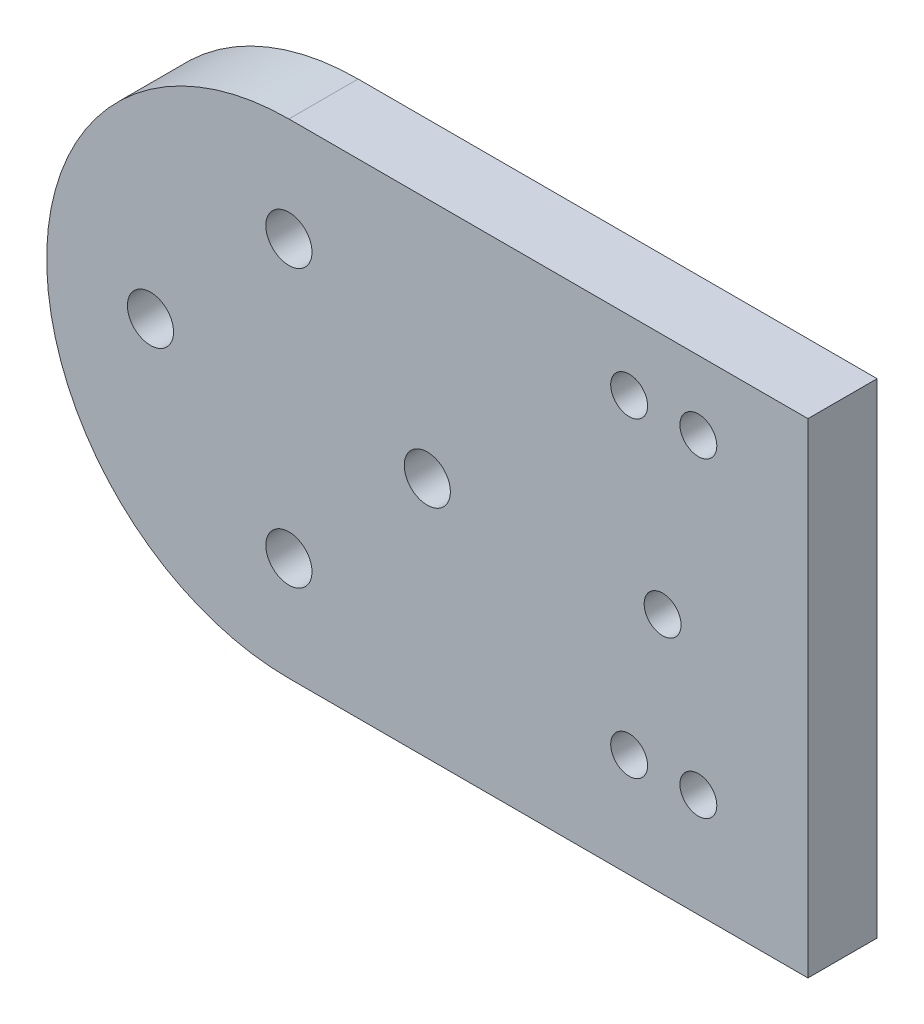
ISO-10303-21;
HEADER;
FILE_DESCRIPTION(('STEP AP214'),'2;1');
FILE_NAME('part.step','',(''),(''),'','','');
FILE_SCHEMA(('AUTOMOTIVE_DESIGN { 1 0 10303 214 1 1 1 1 }'));
ENDSEC;
DATA;
#1=APPLICATION_CONTEXT('core data for automotive mechanical design processes');
#2=APPLICATION_PROTOCOL_DEFINITION('international standard','automotive_design',2000,#1);
#3=PRODUCT_CONTEXT('',#1,'mechanical');
#4=PRODUCT('Part','Part','',(#3));
#5=PRODUCT_RELATED_PRODUCT_CATEGORY('part','',(#4));
#6=PRODUCT_DEFINITION_FORMATION('','',#4);
#7=PRODUCT_DEFINITION_CONTEXT('part definition',#1,'design');
#8=PRODUCT_DEFINITION('design','',#6,#7);
#9=PRODUCT_DEFINITION_SHAPE('','',#8);
#10=(LENGTH_UNIT() NAMED_UNIT(*) SI_UNIT(.MILLI.,.METRE.));
#11=(NAMED_UNIT(*) PLANE_ANGLE_UNIT() SI_UNIT($,.RADIAN.));
#12=(NAMED_UNIT(*) SI_UNIT($,.STERADIAN.) SOLID_ANGLE_UNIT());
#13=UNCERTAINTY_MEASURE_WITH_UNIT(LENGTH_MEASURE(1.E-05),#10,'distance_accuracy_value','');
#14=(GEOMETRIC_REPRESENTATION_CONTEXT(3) GLOBAL_UNCERTAINTY_ASSIGNED_CONTEXT((#13)) GLOBAL_UNIT_ASSIGNED_CONTEXT((#10,
#11,#12)) REPRESENTATION_CONTEXT('',''));
#15=CARTESIAN_POINT('',(0.,0.,0.));
#16=DIRECTION('',(0.,0.,1.));
#17=DIRECTION('',(1.,0.,0.));
#18=AXIS2_PLACEMENT_3D('',#15,#16,#17);
#19=CARTESIAN_POINT('',(0.,0.,6.));
#20=DIRECTION('',(0.,0.,-1.));
#21=DIRECTION('',(-1.,0.,0.));
#22=AXIS2_PLACEMENT_3D('',#19,#20,#21);
#23=CYLINDRICAL_SURFACE('',#22,21.);
#24=CARTESIAN_POINT('',(0.,0.,0.));
#25=DIRECTION('',(0.,0.,1.));
#26=DIRECTION('',(1.,0.,0.));
#27=AXIS2_PLACEMENT_3D('',#24,#25,#26);
#28=CIRCLE('',#27,21.);
#29=CARTESIAN_POINT('',(0.,21.,0.));
#30=VERTEX_POINT('',#29);
#31=CARTESIAN_POINT('',(0.,-21.,0.));
#32=VERTEX_POINT('',#31);
#33=EDGE_CURVE('E149',#30,#32,#28,.T.);
#34=ORIENTED_EDGE('',*,*,#33,.T.);
#35=DIRECTION('',(0.,0.,-1.));
#36=VECTOR('',#35,1.);
#37=CARTESIAN_POINT('',(0.,-21.,6.));
#38=LINE('',#37,#36);
#39=CARTESIAN_POINT('',(0.,-21.,6.));
#40=VERTEX_POINT('',#39);
#41=EDGE_CURVE('E11',#40,#32,#38,.T.);
#42=ORIENTED_EDGE('',*,*,#41,.F.);
#43=CARTESIAN_POINT('',(0.,0.,6.));
#44=DIRECTION('',(0.,0.,1.));
#45=DIRECTION('',(1.,0.,0.));
#46=AXIS2_PLACEMENT_3D('',#43,#44,#45);
#47=CIRCLE('',#46,21.);
#48=CARTESIAN_POINT('',(0.,21.,6.));
#49=VERTEX_POINT('',#48);
#50=EDGE_CURVE('E95',#49,#40,#47,.T.);
#51=ORIENTED_EDGE('',*,*,#50,.F.);
#52=DIRECTION('',(0.,0.,-1.));
#53=VECTOR('',#52,1.);
#54=CARTESIAN_POINT('',(0.,21.,6.));
#55=LINE('',#54,#53);
#56=EDGE_CURVE('E61',#49,#30,#55,.T.);
#57=ORIENTED_EDGE('',*,*,#56,.T.);
#58=EDGE_LOOP('',(#34,#42,#51,#57));
#59=FACE_BOUND('',#58,.T.);
#60=ADVANCED_FACE('F43',(#59),#23,.T.);
#61=CARTESIAN_POINT('',(0.,-21.,6.));
#62=DIRECTION('',(0.,1.,0.));
#63=DIRECTION('',(-1.,0.,0.));
#64=AXIS2_PLACEMENT_3D('',#61,#62,#63);
#65=PLANE('',#64);
#66=DIRECTION('',(1.,0.,0.));
#67=VECTOR('',#66,1.);
#68=CARTESIAN_POINT('',(0.,-21.,0.));
#69=LINE('',#68,#67);
#70=CARTESIAN_POINT('',(45.,-21.,0.));
#71=VERTEX_POINT('',#70);
#72=EDGE_CURVE('E101',#32,#71,#69,.T.);
#73=ORIENTED_EDGE('',*,*,#72,.T.);
#74=DIRECTION('',(0.,0.,-1.));
#75=VECTOR('',#74,1.);
#76=CARTESIAN_POINT('',(45.,-21.,6.));
#77=LINE('',#76,#75);
#78=CARTESIAN_POINT('',(45.,-21.,6.));
#79=VERTEX_POINT('',#78);
#80=EDGE_CURVE('E53',#79,#71,#77,.T.);
#81=ORIENTED_EDGE('',*,*,#80,.F.);
#82=DIRECTION('',(1.,0.,0.));
#83=VECTOR('',#82,1.);
#84=CARTESIAN_POINT('',(0.,-21.,6.));
#85=LINE('',#84,#83);
#86=EDGE_CURVE('E86',#40,#79,#85,.T.);
#87=ORIENTED_EDGE('',*,*,#86,.F.);
#88=ORIENTED_EDGE('',*,*,#41,.T.);
#89=EDGE_LOOP('',(#73,#81,#87,#88));
#90=FACE_BOUND('',#89,.T.);
#91=ADVANCED_FACE('F100',(#90),#65,.F.);
#92=CARTESIAN_POINT('',(45.,0.,6.));
#93=DIRECTION('',(1.,0.,0.));
#94=DIRECTION('',(0.,1.,0.));
#95=AXIS2_PLACEMENT_3D('',#92,#93,#94);
#96=PLANE('',#95);
#97=DIRECTION('',(0.,-1.,0.));
#98=VECTOR('',#97,1.);
#99=CARTESIAN_POINT('',(45.,0.,0.));
#100=LINE('',#99,#98);
#101=CARTESIAN_POINT('',(45.,21.,0.));
#102=VERTEX_POINT('',#101);
#103=EDGE_CURVE('E154',#102,#71,#100,.T.);
#104=ORIENTED_EDGE('',*,*,#103,.F.);
#105=DIRECTION('',(0.,0.,-1.));
#106=VECTOR('',#105,1.);
#107=CARTESIAN_POINT('',(45.,21.,6.));
#108=LINE('',#107,#106);
#109=CARTESIAN_POINT('',(45.,21.,6.));
#110=VERTEX_POINT('',#109);
#111=EDGE_CURVE('E75',#110,#102,#108,.T.);
#112=ORIENTED_EDGE('',*,*,#111,.F.);
#113=DIRECTION('',(0.,-1.,0.));
#114=VECTOR('',#113,1.);
#115=CARTESIAN_POINT('',(45.,0.,6.));
#116=LINE('',#115,#114);
#117=EDGE_CURVE('E94',#110,#79,#116,.T.);
#118=ORIENTED_EDGE('',*,*,#117,.T.);
#119=ORIENTED_EDGE('',*,*,#80,.T.);
#120=EDGE_LOOP('',(#104,#112,#118,#119));
#121=FACE_BOUND('',#120,.T.);
#122=ADVANCED_FACE('F105',(#121),#96,.T.);
#123=CARTESIAN_POINT('',(35.5,15.,6.));
#124=DIRECTION('',(0.,0.,-1.));
#125=DIRECTION('',(-1.,0.,0.));
#126=AXIS2_PLACEMENT_3D('',#123,#124,#125);
#127=CYLINDRICAL_SURFACE('',#126,1.6);
#128=CARTESIAN_POINT('',(35.5,15.,6.));
#129=DIRECTION('',(0.,0.,1.));
#130=DIRECTION('',(1.,0.,0.));
#131=AXIS2_PLACEMENT_3D('',#128,#129,#130);
#132=CIRCLE('',#131,1.6);
#133=CARTESIAN_POINT('',(37.1,15.,6.));
#134=VERTEX_POINT('',#133);
#135=EDGE_CURVE('E125',#134,#134,#132,.T.);
#136=ORIENTED_EDGE('',*,*,#135,.T.);
#137=EDGE_LOOP('',(#136));
#138=FACE_BOUND('',#137,.T.);
#139=CARTESIAN_POINT('',(35.5,15.,0.));
#140=DIRECTION('',(0.,0.,1.));
#141=DIRECTION('',(1.,0.,0.));
#142=AXIS2_PLACEMENT_3D('',#139,#140,#141);
#143=CIRCLE('',#142,1.6);
#144=CARTESIAN_POINT('',(37.1,15.,0.));
#145=VERTEX_POINT('',#144);
#146=EDGE_CURVE('E173',#145,#145,#143,.T.);
#147=ORIENTED_EDGE('',*,*,#146,.F.);
#148=EDGE_LOOP('',(#147));
#149=FACE_BOUND('',#148,.T.);
#150=ADVANCED_FACE('F262',(#138,#149),#127,.F.);
#151=CARTESIAN_POINT('',(35.5,-12.,6.));
#152=DIRECTION('',(0.,0.,-1.));
#153=DIRECTION('',(-1.,0.,0.));
#154=AXIS2_PLACEMENT_3D('',#151,#152,#153);
#155=CYLINDRICAL_SURFACE('',#154,1.6);
#156=CARTESIAN_POINT('',(35.5,-12.,6.));
#157=DIRECTION('',(0.,0.,1.));
#158=DIRECTION('',(1.,0.,0.));
#159=AXIS2_PLACEMENT_3D('',#156,#157,#158);
#160=CIRCLE('',#159,1.6);
#161=CARTESIAN_POINT('',(37.1,-12.,6.));
#162=VERTEX_POINT('',#161);
#163=EDGE_CURVE('E121',#162,#162,#160,.T.);
#164=ORIENTED_EDGE('',*,*,#163,.T.);
#165=EDGE_LOOP('',(#164));
#166=FACE_BOUND('',#165,.T.);
#167=CARTESIAN_POINT('',(35.5,-12.,0.));
#168=DIRECTION('',(0.,0.,1.));
#169=DIRECTION('',(1.,0.,0.));
#170=AXIS2_PLACEMENT_3D('',#167,#168,#169);
#171=CIRCLE('',#170,1.6);
#172=CARTESIAN_POINT('',(37.1,-12.,0.));
#173=VERTEX_POINT('',#172);
#174=EDGE_CURVE('E169',#173,#173,#171,.T.);
#175=ORIENTED_EDGE('',*,*,#174,.F.);
#176=EDGE_LOOP('',(#175));
#177=FACE_BOUND('',#176,.T.);
#178=ADVANCED_FACE('F264',(#166,#177),#155,.F.);
#179=CARTESIAN_POINT('',(29.5,-12.,6.));
#180=DIRECTION('',(0.,0.,-1.));
#181=DIRECTION('',(-1.,0.,0.));
#182=AXIS2_PLACEMENT_3D('',#179,#180,#181);
#183=CYLINDRICAL_SURFACE('',#182,1.6);
#184=CARTESIAN_POINT('',(29.5,-12.,6.));
#185=DIRECTION('',(0.,0.,1.));
#186=DIRECTION('',(1.,0.,0.));
#187=AXIS2_PLACEMENT_3D('',#184,#185,#186);
#188=CIRCLE('',#187,1.6);
#189=CARTESIAN_POINT('',(31.1,-12.,6.));
#190=VERTEX_POINT('',#189);
#191=EDGE_CURVE('E117',#190,#190,#188,.T.);
#192=ORIENTED_EDGE('',*,*,#191,.T.);
#193=EDGE_LOOP('',(#192));
#194=FACE_BOUND('',#193,.T.);
#195=CARTESIAN_POINT('',(29.5,-12.,0.));
#196=DIRECTION('',(0.,0.,1.));
#197=DIRECTION('',(1.,0.,0.));
#198=AXIS2_PLACEMENT_3D('',#195,#196,#197);
#199=CIRCLE('',#198,1.6);
#200=CARTESIAN_POINT('',(31.1,-12.,0.));
#201=VERTEX_POINT('',#200);
#202=EDGE_CURVE('E165',#201,#201,#199,.T.);
#203=ORIENTED_EDGE('',*,*,#202,.F.);
#204=EDGE_LOOP('',(#203));
#205=FACE_BOUND('',#204,.T.);
#206=ADVANCED_FACE('F271',(#194,#205),#183,.F.);
#207=CARTESIAN_POINT('',(32.4,0.,6.));
#208=DIRECTION('',(0.,0.,-1.));
#209=DIRECTION('',(-1.,0.,0.));
#210=AXIS2_PLACEMENT_3D('',#207,#208,#209);
#211=CYLINDRICAL_SURFACE('',#210,1.6);
#212=CARTESIAN_POINT('',(32.4,0.,6.));
#213=DIRECTION('',(0.,0.,1.));
#214=DIRECTION('',(1.,0.,0.));
#215=AXIS2_PLACEMENT_3D('',#212,#213,#214);
#216=CIRCLE('',#215,1.6);
#217=CARTESIAN_POINT('',(34.,0.,6.));
#218=VERTEX_POINT('',#217);
#219=EDGE_CURVE('E110',#218,#218,#216,.T.);
#220=ORIENTED_EDGE('',*,*,#219,.T.);
#221=EDGE_LOOP('',(#220));
#222=FACE_BOUND('',#221,.T.);
#223=CARTESIAN_POINT('',(32.4,0.,0.));
#224=DIRECTION('',(0.,0.,1.));
#225=DIRECTION('',(1.,0.,0.));
#226=AXIS2_PLACEMENT_3D('',#223,#224,#225);
#227=CIRCLE('',#226,1.6);
#228=CARTESIAN_POINT('',(34.,0.,0.));
#229=VERTEX_POINT('',#228);
#230=EDGE_CURVE('E161',#229,#229,#227,.T.);
#231=ORIENTED_EDGE('',*,*,#230,.F.);
#232=EDGE_LOOP('',(#231));
#233=FACE_BOUND('',#232,.T.);
#234=ADVANCED_FACE('F277',(#222,#233),#211,.F.);
#235=CARTESIAN_POINT('',(0.,21.,6.));
#236=DIRECTION('',(0.,1.,0.));
#237=DIRECTION('',(0.,0.,1.));
#238=AXIS2_PLACEMENT_3D('',#235,#236,#237);
#239=PLANE('',#238);
#240=DIRECTION('',(1.,0.,0.));
#241=VECTOR('',#240,1.);
#242=CARTESIAN_POINT('',(0.,21.,0.));
#243=LINE('',#242,#241);
#244=EDGE_CURVE('E157',#30,#102,#243,.T.);
#245=ORIENTED_EDGE('',*,*,#244,.F.);
#246=ORIENTED_EDGE('',*,*,#56,.F.);
#247=DIRECTION('',(1.,0.,0.));
#248=VECTOR('',#247,1.);
#249=CARTESIAN_POINT('',(0.,21.,6.));
#250=LINE('',#249,#248);
#251=EDGE_CURVE('E107',#49,#110,#250,.T.);
#252=ORIENTED_EDGE('',*,*,#251,.T.);
#253=ORIENTED_EDGE('',*,*,#111,.T.);
#254=EDGE_LOOP('',(#245,#246,#252,#253));
#255=FACE_BOUND('',#254,.T.);
#256=ADVANCED_FACE('F235',(#255),#239,.T.);
#257=CARTESIAN_POINT('',(0.,-12.,6.));
#258=DIRECTION('',(0.,0.,-1.));
#259=DIRECTION('',(-1.,0.,0.));
#260=AXIS2_PLACEMENT_3D('',#257,#258,#259);
#261=CYLINDRICAL_SURFACE('',#260,2.);
#262=CARTESIAN_POINT('',(0.,-12.,6.));
#263=DIRECTION('',(0.,0.,1.));
#264=DIRECTION('',(1.,0.,0.));
#265=AXIS2_PLACEMENT_3D('',#262,#263,#264);
#266=CIRCLE('',#265,2.);
#267=CARTESIAN_POINT('',(2.,-12.,6.));
#268=VERTEX_POINT('',#267);
#269=EDGE_CURVE('E201',#268,#268,#266,.T.);
#270=ORIENTED_EDGE('',*,*,#269,.T.);
#271=EDGE_LOOP('',(#270));
#272=FACE_BOUND('',#271,.T.);
#273=CARTESIAN_POINT('',(0.,-12.,0.));
#274=DIRECTION('',(0.,0.,1.));
#275=DIRECTION('',(1.,0.,0.));
#276=AXIS2_PLACEMENT_3D('',#273,#274,#275);
#277=CIRCLE('',#276,2.);
#278=CARTESIAN_POINT('',(2.,-12.,0.));
#279=VERTEX_POINT('',#278);
#280=EDGE_CURVE('E145',#279,#279,#277,.T.);
#281=ORIENTED_EDGE('',*,*,#280,.F.);
#282=EDGE_LOOP('',(#281));
#283=FACE_BOUND('',#282,.T.);
#284=ADVANCED_FACE('F207',(#272,#283),#261,.F.);
#285=CARTESIAN_POINT('',(-12.,0.,6.));
#286=DIRECTION('',(0.,0.,-1.));
#287=DIRECTION('',(-1.,0.,0.));
#288=AXIS2_PLACEMENT_3D('',#285,#286,#287);
#289=CYLINDRICAL_SURFACE('',#288,2.);
#290=CARTESIAN_POINT('',(-12.,0.,6.));
#291=DIRECTION('',(0.,0.,1.));
#292=DIRECTION('',(1.,0.,0.));
#293=AXIS2_PLACEMENT_3D('',#290,#291,#292);
#294=CIRCLE('',#293,2.);
#295=CARTESIAN_POINT('',(-10.,0.,6.));
#296=VERTEX_POINT('',#295);
#297=EDGE_CURVE('E195',#296,#296,#294,.T.);
#298=ORIENTED_EDGE('',*,*,#297,.T.);
#299=EDGE_LOOP('',(#298));
#300=FACE_BOUND('',#299,.T.);
#301=CARTESIAN_POINT('',(-12.,0.,0.));
#302=DIRECTION('',(0.,0.,1.));
#303=DIRECTION('',(1.,0.,0.));
#304=AXIS2_PLACEMENT_3D('',#301,#302,#303);
#305=CIRCLE('',#304,2.);
#306=CARTESIAN_POINT('',(-10.,0.,0.));
#307=VERTEX_POINT('',#306);
#308=EDGE_CURVE('E141',#307,#307,#305,.T.);
#309=ORIENTED_EDGE('',*,*,#308,.F.);
#310=EDGE_LOOP('',(#309));
#311=FACE_BOUND('',#310,.T.);
#312=ADVANCED_FACE('F234',(#300,#311),#289,.F.);
#313=CARTESIAN_POINT('',(0.,12.,6.));
#314=DIRECTION('',(0.,0.,-1.));
#315=DIRECTION('',(-1.,0.,0.));
#316=AXIS2_PLACEMENT_3D('',#313,#314,#315);
#317=CYLINDRICAL_SURFACE('',#316,2.);
#318=CARTESIAN_POINT('',(0.,12.,6.));
#319=DIRECTION('',(0.,0.,1.));
#320=DIRECTION('',(1.,0.,0.));
#321=AXIS2_PLACEMENT_3D('',#318,#319,#320);
#322=CIRCLE('',#321,2.);
#323=CARTESIAN_POINT('',(2.,12.,6.));
#324=VERTEX_POINT('',#323);
#325=EDGE_CURVE('E189',#324,#324,#322,.T.);
#326=ORIENTED_EDGE('',*,*,#325,.T.);
#327=EDGE_LOOP('',(#326));
#328=FACE_BOUND('',#327,.T.);
#329=CARTESIAN_POINT('',(0.,12.,0.));
#330=DIRECTION('',(0.,0.,1.));
#331=DIRECTION('',(1.,0.,0.));
#332=AXIS2_PLACEMENT_3D('',#329,#330,#331);
#333=CIRCLE('',#332,2.);
#334=CARTESIAN_POINT('',(2.,12.,0.));
#335=VERTEX_POINT('',#334);
#336=EDGE_CURVE('E137',#335,#335,#333,.T.);
#337=ORIENTED_EDGE('',*,*,#336,.F.);
#338=EDGE_LOOP('',(#337));
#339=FACE_BOUND('',#338,.T.);
#340=ADVANCED_FACE('F237',(#328,#339),#317,.F.);
#341=CARTESIAN_POINT('',(12.,0.,6.));
#342=DIRECTION('',(0.,0.,-1.));
#343=DIRECTION('',(-1.,0.,0.));
#344=AXIS2_PLACEMENT_3D('',#341,#342,#343);
#345=CYLINDRICAL_SURFACE('',#344,2.);
#346=CARTESIAN_POINT('',(12.,0.,6.));
#347=DIRECTION('',(0.,0.,1.));
#348=DIRECTION('',(1.,0.,0.));
#349=AXIS2_PLACEMENT_3D('',#346,#347,#348);
#350=CIRCLE('',#349,2.);
#351=CARTESIAN_POINT('',(14.,0.,6.));
#352=VERTEX_POINT('',#351);
#353=EDGE_CURVE('E181',#352,#352,#350,.T.);
#354=ORIENTED_EDGE('',*,*,#353,.T.);
#355=EDGE_LOOP('',(#354));
#356=FACE_BOUND('',#355,.T.);
#357=CARTESIAN_POINT('',(12.,0.,0.));
#358=DIRECTION('',(0.,0.,1.));
#359=DIRECTION('',(1.,0.,0.));
#360=AXIS2_PLACEMENT_3D('',#357,#358,#359);
#361=CIRCLE('',#360,2.);
#362=CARTESIAN_POINT('',(14.,0.,0.));
#363=VERTEX_POINT('',#362);
#364=EDGE_CURVE('E133',#363,#363,#361,.T.);
#365=ORIENTED_EDGE('',*,*,#364,.F.);
#366=EDGE_LOOP('',(#365));
#367=FACE_BOUND('',#366,.T.);
#368=ADVANCED_FACE('F45',(#356,#367),#345,.F.);
#369=CARTESIAN_POINT('',(29.5,15.,6.));
#370=DIRECTION('',(0.,0.,-1.));
#371=DIRECTION('',(-1.,0.,0.));
#372=AXIS2_PLACEMENT_3D('',#369,#370,#371);
#373=CYLINDRICAL_SURFACE('',#372,1.6);
#374=CARTESIAN_POINT('',(29.5,15.,6.));
#375=DIRECTION('',(0.,0.,1.));
#376=DIRECTION('',(1.,0.,0.));
#377=AXIS2_PLACEMENT_3D('',#374,#375,#376);
#378=CIRCLE('',#377,1.6);
#379=CARTESIAN_POINT('',(31.1,15.,6.));
#380=VERTEX_POINT('',#379);
#381=EDGE_CURVE('E129',#380,#380,#378,.T.);
#382=ORIENTED_EDGE('',*,*,#381,.T.);
#383=EDGE_LOOP('',(#382));
#384=FACE_BOUND('',#383,.T.);
#385=CARTESIAN_POINT('',(29.5,15.,0.));
#386=DIRECTION('',(0.,0.,1.));
#387=DIRECTION('',(1.,0.,0.));
#388=AXIS2_PLACEMENT_3D('',#385,#386,#387);
#389=CIRCLE('',#388,1.6);
#390=CARTESIAN_POINT('',(31.1,15.,0.));
#391=VERTEX_POINT('',#390);
#392=EDGE_CURVE('E177',#391,#391,#389,.T.);
#393=ORIENTED_EDGE('',*,*,#392,.F.);
#394=EDGE_LOOP('',(#393));
#395=FACE_BOUND('',#394,.T.);
#396=ADVANCED_FACE('F212',(#384,#395),#373,.F.);
#397=CARTESIAN_POINT('',(0.,0.,6.));
#398=DIRECTION('',(0.,0.,1.));
#399=DIRECTION('',(1.,0.,0.));
#400=AXIS2_PLACEMENT_3D('',#397,#398,#399);
#401=PLANE('',#400);
#402=ORIENTED_EDGE('',*,*,#353,.F.);
#403=EDGE_LOOP('',(#402));
#404=FACE_BOUND('',#403,.T.);
#405=ORIENTED_EDGE('',*,*,#325,.F.);
#406=EDGE_LOOP('',(#405));
#407=FACE_BOUND('',#406,.T.);
#408=ORIENTED_EDGE('',*,*,#297,.F.);
#409=EDGE_LOOP('',(#408));
#410=FACE_BOUND('',#409,.T.);
#411=ORIENTED_EDGE('',*,*,#269,.F.);
#412=EDGE_LOOP('',(#411));
#413=FACE_BOUND('',#412,.T.);
#414=ORIENTED_EDGE('',*,*,#50,.T.);
#415=ORIENTED_EDGE('',*,*,#86,.T.);
#416=ORIENTED_EDGE('',*,*,#117,.F.);
#417=ORIENTED_EDGE('',*,*,#251,.F.);
#418=EDGE_LOOP('',(#414,#415,#416,#417));
#419=FACE_BOUND('',#418,.T.);
#420=ORIENTED_EDGE('',*,*,#219,.F.);
#421=EDGE_LOOP('',(#420));
#422=FACE_BOUND('',#421,.T.);
#423=ORIENTED_EDGE('',*,*,#191,.F.);
#424=EDGE_LOOP('',(#423));
#425=FACE_BOUND('',#424,.T.);
#426=ORIENTED_EDGE('',*,*,#163,.F.);
#427=EDGE_LOOP('',(#426));
#428=FACE_BOUND('',#427,.T.);
#429=ORIENTED_EDGE('',*,*,#135,.F.);
#430=EDGE_LOOP('',(#429));
#431=FACE_BOUND('',#430,.T.);
#432=ORIENTED_EDGE('',*,*,#381,.F.);
#433=EDGE_LOOP('',(#432));
#434=FACE_BOUND('',#433,.T.);
#435=ADVANCED_FACE('F90',(#404,#407,#410,#413,#419,#422,#425,#428,#431,#434),#401,.T.);
#436=CARTESIAN_POINT('',(0.,0.,0.));
#437=DIRECTION('',(0.,0.,1.));
#438=DIRECTION('',(1.,0.,0.));
#439=AXIS2_PLACEMENT_3D('',#436,#437,#438);
#440=PLANE('',#439);
#441=ORIENTED_EDGE('',*,*,#364,.T.);
#442=EDGE_LOOP('',(#441));
#443=FACE_BOUND('',#442,.T.);
#444=ORIENTED_EDGE('',*,*,#336,.T.);
#445=EDGE_LOOP('',(#444));
#446=FACE_BOUND('',#445,.T.);
#447=ORIENTED_EDGE('',*,*,#308,.T.);
#448=EDGE_LOOP('',(#447));
#449=FACE_BOUND('',#448,.T.);
#450=ORIENTED_EDGE('',*,*,#280,.T.);
#451=EDGE_LOOP('',(#450));
#452=FACE_BOUND('',#451,.T.);
#453=ORIENTED_EDGE('',*,*,#33,.F.);
#454=ORIENTED_EDGE('',*,*,#244,.T.);
#455=ORIENTED_EDGE('',*,*,#103,.T.);
#456=ORIENTED_EDGE('',*,*,#72,.F.);
#457=EDGE_LOOP('',(#453,#454,#455,#456));
#458=FACE_BOUND('',#457,.T.);
#459=ORIENTED_EDGE('',*,*,#230,.T.);
#460=EDGE_LOOP('',(#459));
#461=FACE_BOUND('',#460,.T.);
#462=ORIENTED_EDGE('',*,*,#202,.T.);
#463=EDGE_LOOP('',(#462));
#464=FACE_BOUND('',#463,.T.);
#465=ORIENTED_EDGE('',*,*,#174,.T.);
#466=EDGE_LOOP('',(#465));
#467=FACE_BOUND('',#466,.T.);
#468=ORIENTED_EDGE('',*,*,#146,.T.);
#469=EDGE_LOOP('',(#468));
#470=FACE_BOUND('',#469,.T.);
#471=ORIENTED_EDGE('',*,*,#392,.T.);
#472=EDGE_LOOP('',(#471));
#473=FACE_BOUND('',#472,.T.);
#474=ADVANCED_FACE('F211',(#443,#446,#449,#452,#458,#461,#464,#467,#470,#473),#440,.F.);
#475=CLOSED_SHELL('',(#60,#91,#122,#150,#178,#206,#234,#256,#284,#312,#340,#368,#396,#435,#474));
#476=MANIFOLD_SOLID_BREP('B2',#475);
#477=ADVANCED_BREP_SHAPE_REPRESENTATION('',(#18,#476),#14);
#478=SHAPE_DEFINITION_REPRESENTATION(#9,#477);
ENDSEC;
END-ISO-10303-21;
